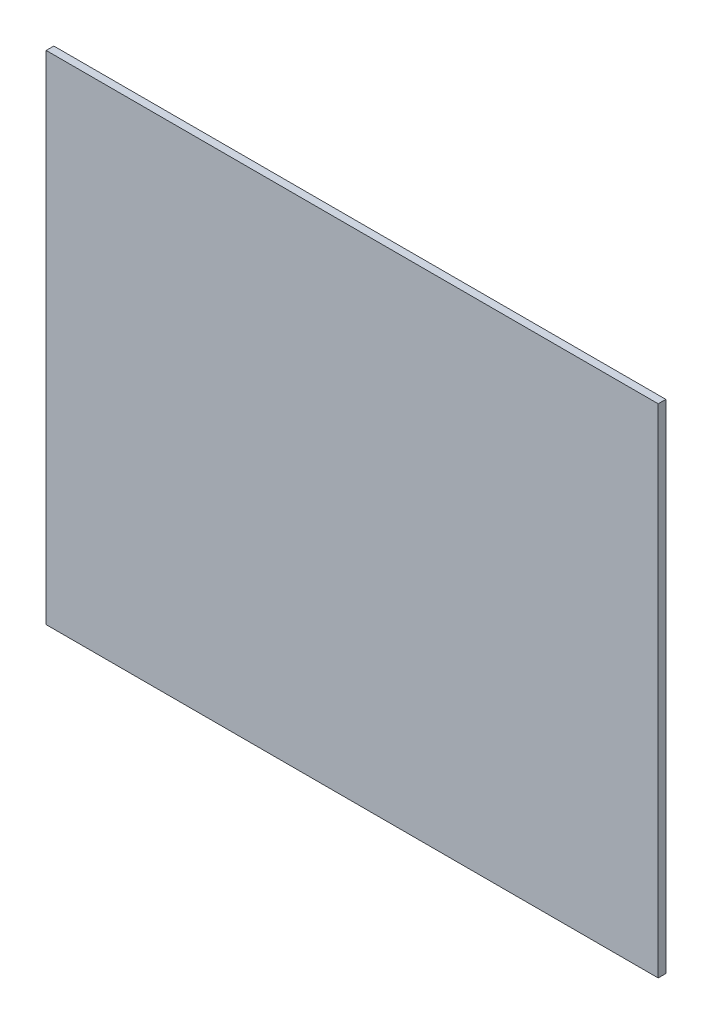
ISO-10303-21;
HEADER;
FILE_DESCRIPTION(('STEP AP214'),'2;1');
FILE_NAME('part.step','',(''),(''),'','','');
FILE_SCHEMA(('AUTOMOTIVE_DESIGN { 1 0 10303 214 1 1 1 1 }'));
ENDSEC;
DATA;
#1=APPLICATION_CONTEXT('core data for automotive mechanical design processes');
#2=APPLICATION_PROTOCOL_DEFINITION('international standard','automotive_design',2000,#1);
#3=PRODUCT_CONTEXT('',#1,'mechanical');
#4=PRODUCT('Part','Part','',(#3));
#5=PRODUCT_RELATED_PRODUCT_CATEGORY('part','',(#4));
#6=PRODUCT_DEFINITION_FORMATION('','',#4);
#7=PRODUCT_DEFINITION_CONTEXT('part definition',#1,'design');
#8=PRODUCT_DEFINITION('design','',#6,#7);
#9=PRODUCT_DEFINITION_SHAPE('','',#8);
#10=(LENGTH_UNIT() NAMED_UNIT(*) SI_UNIT(.MILLI.,.METRE.));
#11=(NAMED_UNIT(*) PLANE_ANGLE_UNIT() SI_UNIT($,.RADIAN.));
#12=(NAMED_UNIT(*) SI_UNIT($,.STERADIAN.) SOLID_ANGLE_UNIT());
#13=UNCERTAINTY_MEASURE_WITH_UNIT(LENGTH_MEASURE(1.E-05),#10,'distance_accuracy_value','');
#14=(GEOMETRIC_REPRESENTATION_CONTEXT(3) GLOBAL_UNCERTAINTY_ASSIGNED_CONTEXT((#13)) GLOBAL_UNIT_ASSIGNED_CONTEXT((#10,
#11,#12)) REPRESENTATION_CONTEXT('',''));
#15=CARTESIAN_POINT('',(0.,0.,0.));
#16=DIRECTION('',(0.,0.,1.));
#17=DIRECTION('',(1.,0.,0.));
#18=AXIS2_PLACEMENT_3D('',#15,#16,#17);
#19=CARTESIAN_POINT('',(-400.,-325.,-10.));
#20=DIRECTION('',(-1.,0.,0.));
#21=DIRECTION('',(0.,0.,1.));
#22=AXIS2_PLACEMENT_3D('',#19,#20,#21);
#23=PLANE('',#22);
#24=DIRECTION('',(0.,-1.,0.));
#25=VECTOR('',#24,1.);
#26=CARTESIAN_POINT('',(-400.,-325.,0.));
#27=LINE('',#26,#25);
#28=CARTESIAN_POINT('',(-400.,325.,0.));
#29=VERTEX_POINT('',#28);
#30=CARTESIAN_POINT('',(-400.,-325.,0.));
#31=VERTEX_POINT('',#30);
#32=EDGE_CURVE('E102',#29,#31,#27,.T.);
#33=ORIENTED_EDGE('',*,*,#32,.F.);
#34=DIRECTION('',(0.,0.,1.));
#35=VECTOR('',#34,1.);
#36=CARTESIAN_POINT('',(-400.,325.,-10.));
#37=LINE('',#36,#35);
#38=CARTESIAN_POINT('',(-400.,325.,-10.));
#39=VERTEX_POINT('',#38);
#40=EDGE_CURVE('E11',#39,#29,#37,.T.);
#41=ORIENTED_EDGE('',*,*,#40,.F.);
#42=DIRECTION('',(0.,-1.,0.));
#43=VECTOR('',#42,1.);
#44=CARTESIAN_POINT('',(-400.,-325.,-10.));
#45=LINE('',#44,#43);
#46=CARTESIAN_POINT('',(-400.,-325.,-10.));
#47=VERTEX_POINT('',#46);
#48=EDGE_CURVE('E96',#39,#47,#45,.T.);
#49=ORIENTED_EDGE('',*,*,#48,.T.);
#50=DIRECTION('',(0.,0.,1.));
#51=VECTOR('',#50,1.);
#52=CARTESIAN_POINT('',(-400.,-325.,-10.));
#53=LINE('',#52,#51);
#54=EDGE_CURVE('E41',#47,#31,#53,.T.);
#55=ORIENTED_EDGE('',*,*,#54,.T.);
#56=EDGE_LOOP('',(#33,#41,#49,#55));
#57=FACE_BOUND('',#56,.T.);
#58=ADVANCED_FACE('F38',(#57),#23,.T.);
#59=CARTESIAN_POINT('',(400.,325.,-10.));
#60=DIRECTION('',(0.,1.,0.));
#61=DIRECTION('',(-1.,0.,0.));
#62=AXIS2_PLACEMENT_3D('',#59,#60,#61);
#63=PLANE('',#62);
#64=DIRECTION('',(-1.,0.,0.));
#65=VECTOR('',#64,1.);
#66=CARTESIAN_POINT('',(400.,325.,0.));
#67=LINE('',#66,#65);
#68=CARTESIAN_POINT('',(400.,325.,0.));
#69=VERTEX_POINT('',#68);
#70=EDGE_CURVE('E98',#69,#29,#67,.T.);
#71=ORIENTED_EDGE('',*,*,#70,.F.);
#72=DIRECTION('',(0.,0.,1.));
#73=VECTOR('',#72,1.);
#74=CARTESIAN_POINT('',(400.,325.,-10.));
#75=LINE('',#74,#73);
#76=CARTESIAN_POINT('',(400.,325.,-10.));
#77=VERTEX_POINT('',#76);
#78=EDGE_CURVE('E47',#77,#69,#75,.T.);
#79=ORIENTED_EDGE('',*,*,#78,.F.);
#80=DIRECTION('',(-1.,0.,0.));
#81=VECTOR('',#80,1.);
#82=CARTESIAN_POINT('',(400.,325.,-10.));
#83=LINE('',#82,#81);
#84=EDGE_CURVE('E93',#77,#39,#83,.T.);
#85=ORIENTED_EDGE('',*,*,#84,.T.);
#86=ORIENTED_EDGE('',*,*,#40,.T.);
#87=EDGE_LOOP('',(#71,#79,#85,#86));
#88=FACE_BOUND('',#87,.T.);
#89=ADVANCED_FACE('F112',(#88),#63,.T.);
#90=CARTESIAN_POINT('',(400.,-325.,-10.));
#91=DIRECTION('',(1.,0.,0.));
#92=DIRECTION('',(0.,0.,-1.));
#93=AXIS2_PLACEMENT_3D('',#90,#91,#92);
#94=PLANE('',#93);
#95=DIRECTION('',(0.,1.,0.));
#96=VECTOR('',#95,1.);
#97=CARTESIAN_POINT('',(400.,-325.,0.));
#98=LINE('',#97,#96);
#99=CARTESIAN_POINT('',(400.,-325.,0.));
#100=VERTEX_POINT('',#99);
#101=EDGE_CURVE('E88',#100,#69,#98,.T.);
#102=ORIENTED_EDGE('',*,*,#101,.F.);
#103=DIRECTION('',(0.,0.,1.));
#104=VECTOR('',#103,1.);
#105=CARTESIAN_POINT('',(400.,-325.,-10.));
#106=LINE('',#105,#104);
#107=CARTESIAN_POINT('',(400.,-325.,-10.));
#108=VERTEX_POINT('',#107);
#109=EDGE_CURVE('E83',#108,#100,#106,.T.);
#110=ORIENTED_EDGE('',*,*,#109,.F.);
#111=DIRECTION('',(0.,1.,0.));
#112=VECTOR('',#111,1.);
#113=CARTESIAN_POINT('',(400.,-325.,-10.));
#114=LINE('',#113,#112);
#115=EDGE_CURVE('E86',#108,#77,#114,.T.);
#116=ORIENTED_EDGE('',*,*,#115,.T.);
#117=ORIENTED_EDGE('',*,*,#78,.T.);
#118=EDGE_LOOP('',(#102,#110,#116,#117));
#119=FACE_BOUND('',#118,.T.);
#120=ADVANCED_FACE('F85',(#119),#94,.T.);
#121=CARTESIAN_POINT('',(400.,-325.,-10.));
#122=DIRECTION('',(0.,-1.,0.));
#123=DIRECTION('',(1.,0.,0.));
#124=AXIS2_PLACEMENT_3D('',#121,#122,#123);
#125=PLANE('',#124);
#126=DIRECTION('',(1.,0.,0.));
#127=VECTOR('',#126,1.);
#128=CARTESIAN_POINT('',(400.,-325.,0.));
#129=LINE('',#128,#127);
#130=EDGE_CURVE('E105',#31,#100,#129,.T.);
#131=ORIENTED_EDGE('',*,*,#130,.F.);
#132=ORIENTED_EDGE('',*,*,#54,.F.);
#133=DIRECTION('',(1.,0.,0.));
#134=VECTOR('',#133,1.);
#135=CARTESIAN_POINT('',(400.,-325.,-10.));
#136=LINE('',#135,#134);
#137=EDGE_CURVE('E92',#47,#108,#136,.T.);
#138=ORIENTED_EDGE('',*,*,#137,.T.);
#139=ORIENTED_EDGE('',*,*,#109,.T.);
#140=EDGE_LOOP('',(#131,#132,#138,#139));
#141=FACE_BOUND('',#140,.T.);
#142=ADVANCED_FACE('F95',(#141),#125,.T.);
#143=CARTESIAN_POINT('',(0.,0.,-10.));
#144=DIRECTION('',(0.,0.,1.));
#145=DIRECTION('',(1.,0.,0.));
#146=AXIS2_PLACEMENT_3D('',#143,#144,#145);
#147=PLANE('',#146);
#148=ORIENTED_EDGE('',*,*,#48,.F.);
#149=ORIENTED_EDGE('',*,*,#84,.F.);
#150=ORIENTED_EDGE('',*,*,#115,.F.);
#151=ORIENTED_EDGE('',*,*,#137,.F.);
#152=EDGE_LOOP('',(#148,#149,#150,#151));
#153=FACE_BOUND('',#152,.T.);
#154=ADVANCED_FACE('F91',(#153),#147,.F.);
#155=CARTESIAN_POINT('',(0.,0.,0.));
#156=DIRECTION('',(0.,0.,1.));
#157=DIRECTION('',(1.,0.,0.));
#158=AXIS2_PLACEMENT_3D('',#155,#156,#157);
#159=PLANE('',#158);
#160=ORIENTED_EDGE('',*,*,#32,.T.);
#161=ORIENTED_EDGE('',*,*,#130,.T.);
#162=ORIENTED_EDGE('',*,*,#101,.T.);
#163=ORIENTED_EDGE('',*,*,#70,.T.);
#164=EDGE_LOOP('',(#160,#161,#162,#163));
#165=FACE_BOUND('',#164,.T.);
#166=ADVANCED_FACE('F111',(#165),#159,.T.);
#167=CLOSED_SHELL('',(#58,#89,#120,#142,#154,#166));
#168=MANIFOLD_SOLID_BREP('B2',#167);
#169=ADVANCED_BREP_SHAPE_REPRESENTATION('',(#18,#168),#14);
#170=SHAPE_DEFINITION_REPRESENTATION(#9,#169);
ENDSEC;
END-ISO-10303-21;
